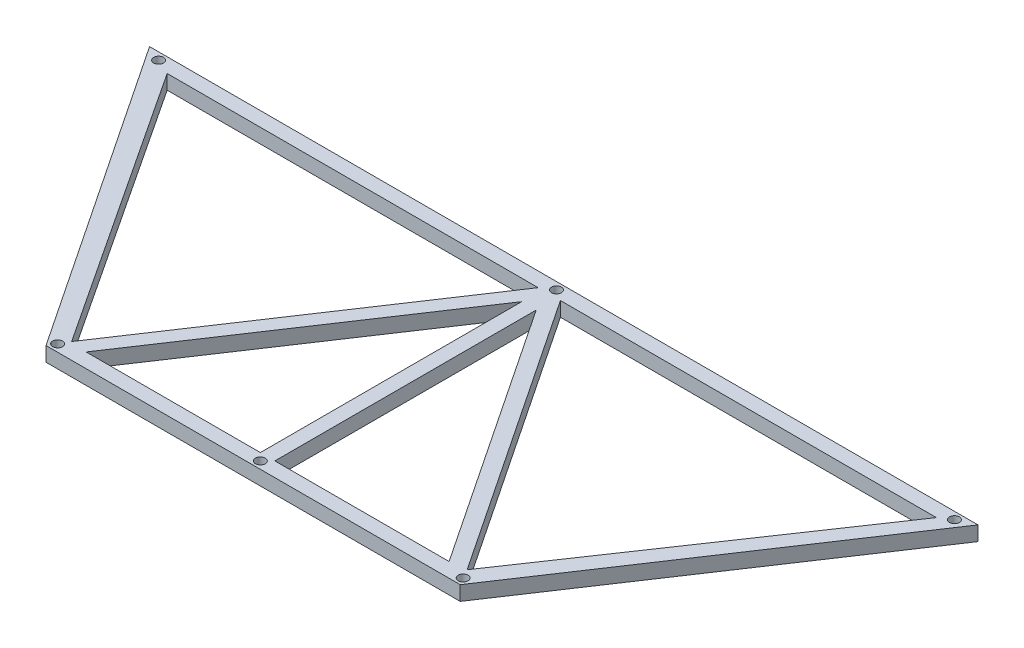
ISO-10303-21;
HEADER;
FILE_DESCRIPTION(('STEP AP214'),'2;1');
FILE_NAME('part.step','',(''),(''),'','','');
FILE_SCHEMA(('AUTOMOTIVE_DESIGN { 1 0 10303 214 1 1 1 1 }'));
ENDSEC;
DATA;
#1=APPLICATION_CONTEXT('core data for automotive mechanical design processes');
#2=APPLICATION_PROTOCOL_DEFINITION('international standard','automotive_design',2000,#1);
#3=PRODUCT_CONTEXT('',#1,'mechanical');
#4=PRODUCT('Part','Part','',(#3));
#5=PRODUCT_RELATED_PRODUCT_CATEGORY('part','',(#4));
#6=PRODUCT_DEFINITION_FORMATION('','',#4);
#7=PRODUCT_DEFINITION_CONTEXT('part definition',#1,'design');
#8=PRODUCT_DEFINITION('design','',#6,#7);
#9=PRODUCT_DEFINITION_SHAPE('','',#8);
#10=(LENGTH_UNIT() NAMED_UNIT(*) SI_UNIT(.MILLI.,.METRE.));
#11=(NAMED_UNIT(*) PLANE_ANGLE_UNIT() SI_UNIT($,.RADIAN.));
#12=(NAMED_UNIT(*) SI_UNIT($,.STERADIAN.) SOLID_ANGLE_UNIT());
#13=UNCERTAINTY_MEASURE_WITH_UNIT(LENGTH_MEASURE(1.E-05),#10,'distance_accuracy_value','');
#14=(GEOMETRIC_REPRESENTATION_CONTEXT(3) GLOBAL_UNCERTAINTY_ASSIGNED_CONTEXT((#13)) GLOBAL_UNIT_ASSIGNED_CONTEXT((#10,
#11,#12)) REPRESENTATION_CONTEXT('',''));
#15=CARTESIAN_POINT('',(0.,0.,0.));
#16=DIRECTION('',(0.,0.,1.));
#17=DIRECTION('',(1.,0.,0.));
#18=AXIS2_PLACEMENT_3D('',#15,#16,#17);
#19=CARTESIAN_POINT('',(0.,14.,0.));
#20=DIRECTION('',(0.,1.,0.));
#21=DIRECTION('',(0.,0.,1.));
#22=AXIS2_PLACEMENT_3D('',#19,#20,#21);
#23=PLANE('',#22);
#24=CARTESIAN_POINT('',(0.,14.,-7.));
#25=DIRECTION('',(0.,1.,0.));
#26=DIRECTION('',(0.,0.,1.));
#27=AXIS2_PLACEMENT_3D('',#24,#25,#26);
#28=CIRCLE('',#27,4.7625);
#29=CARTESIAN_POINT('',(0.,14.,-2.2375));
#30=VERTEX_POINT('',#29);
#31=EDGE_CURVE('E237',#30,#30,#28,.T.);
#32=ORIENTED_EDGE('',*,*,#31,.F.);
#33=EDGE_LOOP('',(#32));
#34=FACE_BOUND('',#33,.T.);
#35=CARTESIAN_POINT('',(384.258956968318,14.,-293.));
#36=DIRECTION('',(0.,1.,0.));
#37=DIRECTION('',(0.,0.,1.));
#38=AXIS2_PLACEMENT_3D('',#35,#36,#37);
#39=CIRCLE('',#38,4.76250000000001);
#40=CARTESIAN_POINT('',(384.258956968318,14.,-288.2375));
#41=VERTEX_POINT('',#40);
#42=EDGE_CURVE('E252',#41,#41,#39,.T.);
#43=ORIENTED_EDGE('',*,*,#42,.F.);
#44=EDGE_LOOP('',(#43));
#45=FACE_BOUND('',#44,.T.);
#46=DIRECTION('',(-1.,0.,0.));
#47=VECTOR('',#46,1.);
#48=CARTESIAN_POINT('',(10.7462863094159,14.,-286.));
#49=LINE('',#48,#47);
#50=CARTESIAN_POINT('',(373.840760714501,14.,-286.));
#51=VERTEX_POINT('',#50);
#52=CARTESIAN_POINT('',(10.7462863094159,14.,-286.));
#53=VERTEX_POINT('',#52);
#54=EDGE_CURVE('E271',#51,#53,#49,.T.);
#55=ORIENTED_EDGE('',*,*,#54,.F.);
#56=DIRECTION('',(0.560869786562697,0.,-0.827904029777072));
#57=VECTOR('',#56,1.);
#58=CARTESIAN_POINT('',(373.840760714501,14.,-286.));
#59=LINE('',#58,#57);
#60=CARTESIAN_POINT('',(190.836035911784,14.,-15.8653755964487));
#61=VERTEX_POINT('',#60);
#62=EDGE_CURVE('E268',#61,#51,#59,.T.);
#63=ORIENTED_EDGE('',*,*,#62,.F.);
#64=DIRECTION('',(0.55470019622523,0.,0.832050294337843));
#65=VECTOR('',#64,1.);
#66=CARTESIAN_POINT('',(190.836035911784,14.,-15.8653755964487));
#67=LINE('',#66,#65);
#68=EDGE_CURVE('E277',#53,#61,#67,.T.);
#69=ORIENTED_EDGE('',*,*,#68,.F.);
#70=EDGE_LOOP('',(#55,#63,#69));
#71=FACE_BOUND('',#70,.T.);
#72=DIRECTION('',(-0.55470019622523,0.,-0.832050294337843));
#73=VECTOR('',#72,1.);
#74=CARTESIAN_POINT('',(175.253713690584,14.,-14.0000000000001));
#75=LINE('',#74,#73);
#76=CARTESIAN_POINT('',(175.253713690584,14.,-14.0000000000001));
#77=VERTEX_POINT('',#76);
#78=CARTESIAN_POINT('',(6.99999999999995,14.,-266.380570535876));
#79=VERTEX_POINT('',#78);
#80=EDGE_CURVE('E301',#77,#79,#75,.T.);
#81=ORIENTED_EDGE('',*,*,#80,.F.);
#82=DIRECTION('',(1.,0.,0.));
#83=VECTOR('',#82,1.);
#84=CARTESIAN_POINT('',(175.253713690584,14.,-14.0000000000001));
#85=LINE('',#84,#83);
#86=CARTESIAN_POINT('',(7.00000000000001,14.,-14.));
#87=VERTEX_POINT('',#86);
#88=EDGE_CURVE('E302',#87,#77,#85,.T.);
#89=ORIENTED_EDGE('',*,*,#88,.F.);
#90=DIRECTION('',(0.,0.,1.));
#91=VECTOR('',#90,1.);
#92=CARTESIAN_POINT('',(7.00000000000001,14.,-14.));
#93=LINE('',#92,#91);
#94=EDGE_CURVE('E310',#79,#87,#93,.T.);
#95=ORIENTED_EDGE('',*,*,#94,.F.);
#96=EDGE_LOOP('',(#81,#89,#95));
#97=FACE_BOUND('',#96,.T.);
#98=CARTESIAN_POINT('',(-195.793523511959,14.,-7.));
#99=DIRECTION('',(0.,1.,0.));
#100=DIRECTION('',(0.,0.,1.));
#101=AXIS2_PLACEMENT_3D('',#98,#99,#100);
#102=CIRCLE('',#101,4.76250000000001);
#103=CARTESIAN_POINT('',(-195.793523511959,14.,-2.23749999999999));
#104=VERTEX_POINT('',#103);
#105=EDGE_CURVE('E331',#104,#104,#102,.T.);
#106=ORIENTED_EDGE('',*,*,#105,.F.);
#107=EDGE_LOOP('',(#106));
#108=FACE_BOUND('',#107,.T.);
#109=DIRECTION('',(0.554700196225229,0.,-0.832050294337844));
#110=VECTOR('',#109,1.);
#111=CARTESIAN_POINT('',(400.,14.,-300.));
#112=LINE('',#111,#110);
#113=CARTESIAN_POINT('',(200.,14.,0.));
#114=VERTEX_POINT('',#113);
#115=CARTESIAN_POINT('',(400.,14.,-300.));
#116=VERTEX_POINT('',#115);
#117=EDGE_CURVE('E345',#114,#116,#112,.T.);
#118=ORIENTED_EDGE('',*,*,#117,.T.);
#119=DIRECTION('',(-1.,0.,0.));
#120=VECTOR('',#119,1.);
#121=CARTESIAN_POINT('',(0.,14.,-300.));
#122=LINE('',#121,#120);
#123=CARTESIAN_POINT('',(-400.,14.,-300.));
#124=VERTEX_POINT('',#123);
#125=EDGE_CURVE('E347',#116,#124,#122,.T.);
#126=ORIENTED_EDGE('',*,*,#125,.T.);
#127=DIRECTION('',(0.554700196225229,0.,0.832050294337844));
#128=VECTOR('',#127,1.);
#129=CARTESIAN_POINT('',(-400.,14.,-300.));
#130=LINE('',#129,#128);
#131=CARTESIAN_POINT('',(-200.,14.,0.));
#132=VERTEX_POINT('',#131);
#133=EDGE_CURVE('E348',#124,#132,#130,.T.);
#134=ORIENTED_EDGE('',*,*,#133,.T.);
#135=DIRECTION('',(1.,0.,0.));
#136=VECTOR('',#135,1.);
#137=CARTESIAN_POINT('',(-200.,14.,0.));
#138=LINE('',#137,#136);
#139=EDGE_CURVE('E355',#132,#114,#138,.T.);
#140=ORIENTED_EDGE('',*,*,#139,.T.);
#141=EDGE_LOOP('',(#118,#126,#134,#140));
#142=FACE_BOUND('',#141,.T.);
#143=CARTESIAN_POINT('',(195.793523511959,14.,-7.));
#144=DIRECTION('',(0.,1.,0.));
#145=DIRECTION('',(0.,0.,-1.));
#146=AXIS2_PLACEMENT_3D('',#143,#144,#145);
#147=CIRCLE('',#146,4.76250000000001);
#148=CARTESIAN_POINT('',(195.793523511959,14.,-11.7625));
#149=VERTEX_POINT('',#148);
#150=EDGE_CURVE('E257',#149,#149,#147,.T.);
#151=ORIENTED_EDGE('',*,*,#150,.F.);
#152=EDGE_LOOP('',(#151));
#153=FACE_BOUND('',#152,.T.);
#154=CARTESIAN_POINT('',(-384.258956968318,14.,-293.));
#155=DIRECTION('',(0.,1.,0.));
#156=DIRECTION('',(0.,0.,-1.));
#157=AXIS2_PLACEMENT_3D('',#154,#155,#156);
#158=CIRCLE('',#157,4.76250000000001);
#159=CARTESIAN_POINT('',(-384.258956968318,14.,-297.7625));
#160=VERTEX_POINT('',#159);
#161=EDGE_CURVE('E243',#160,#160,#158,.T.);
#162=ORIENTED_EDGE('',*,*,#161,.F.);
#163=EDGE_LOOP('',(#162));
#164=FACE_BOUND('',#163,.T.);
#165=CARTESIAN_POINT('',(0.,14.,-293.));
#166=DIRECTION('',(0.,1.,0.));
#167=DIRECTION('',(0.,0.,1.));
#168=AXIS2_PLACEMENT_3D('',#165,#166,#167);
#169=CIRCLE('',#168,4.7625);
#170=CARTESIAN_POINT('',(0.,14.,-288.2375));
#171=VERTEX_POINT('',#170);
#172=EDGE_CURVE('E230',#171,#171,#169,.T.);
#173=ORIENTED_EDGE('',*,*,#172,.F.);
#174=EDGE_LOOP('',(#173));
#175=FACE_BOUND('',#174,.T.);
#176=DIRECTION('',(0.554700196225229,0.,-0.832050294337844));
#177=VECTOR('',#176,1.);
#178=CARTESIAN_POINT('',(-190.947369665805,14.,-15.6983749654168));
#179=LINE('',#178,#177);
#180=CARTESIAN_POINT('',(-190.947369665805,14.,-15.6983749654168));
#181=VERTEX_POINT('',#180);
#182=CARTESIAN_POINT('',(-10.7462863094161,14.,-286.));
#183=VERTEX_POINT('',#182);
#184=EDGE_CURVE('E196',#181,#183,#179,.T.);
#185=ORIENTED_EDGE('',*,*,#184,.F.);
#186=DIRECTION('',(0.550084799449605,0.,0.835108803339114));
#187=VECTOR('',#186,1.);
#188=CARTESIAN_POINT('',(-368.994606868348,14.,-286.));
#189=LINE('',#188,#187);
#190=CARTESIAN_POINT('',(-368.994606868348,14.,-286.));
#191=VERTEX_POINT('',#190);
#192=EDGE_CURVE('E193',#191,#181,#189,.T.);
#193=ORIENTED_EDGE('',*,*,#192,.F.);
#194=DIRECTION('',(-1.,0.,0.));
#195=VECTOR('',#194,1.);
#196=CARTESIAN_POINT('',(-10.7462863094161,14.,-286.));
#197=LINE('',#196,#195);
#198=EDGE_CURVE('E201',#183,#191,#197,.T.);
#199=ORIENTED_EDGE('',*,*,#198,.F.);
#200=EDGE_LOOP('',(#185,#193,#199));
#201=FACE_BOUND('',#200,.T.);
#202=DIRECTION('',(0.,0.,-1.));
#203=VECTOR('',#202,1.);
#204=CARTESIAN_POINT('',(-6.99999999999998,14.,-14.));
#205=LINE('',#204,#203);
#206=CARTESIAN_POINT('',(-6.99999999999998,14.,-14.));
#207=VERTEX_POINT('',#206);
#208=CARTESIAN_POINT('',(-7.0000000000001,14.,-266.380570535876));
#209=VERTEX_POINT('',#208);
#210=EDGE_CURVE('E169',#207,#209,#205,.T.);
#211=ORIENTED_EDGE('',*,*,#210,.F.);
#212=DIRECTION('',(1.,0.,0.));
#213=VECTOR('',#212,1.);
#214=CARTESIAN_POINT('',(-175.253713690584,14.,-14.));
#215=LINE('',#214,#213);
#216=CARTESIAN_POINT('',(-175.253713690584,14.,-14.));
#217=VERTEX_POINT('',#216);
#218=EDGE_CURVE('E157',#217,#207,#215,.T.);
#219=ORIENTED_EDGE('',*,*,#218,.F.);
#220=DIRECTION('',(-0.554700196225229,0.,0.832050294337844));
#221=VECTOR('',#220,1.);
#222=CARTESIAN_POINT('',(-175.253713690584,14.,-14.));
#223=LINE('',#222,#221);
#224=EDGE_CURVE('E179',#209,#217,#223,.T.);
#225=ORIENTED_EDGE('',*,*,#224,.F.);
#226=EDGE_LOOP('',(#211,#219,#225));
#227=FACE_BOUND('',#226,.T.);
#228=ADVANCED_FACE('F44',(#34,#45,#71,#97,#108,#142,#153,#164,#175,#201,#227),#23,.T.);
#229=CARTESIAN_POINT('',(0.,0.,0.));
#230=DIRECTION('',(0.,1.,0.));
#231=DIRECTION('',(0.,0.,1.));
#232=AXIS2_PLACEMENT_3D('',#229,#230,#231);
#233=PLANE('',#232);
#234=DIRECTION('',(0.550084799449605,0.,0.835108803339114));
#235=VECTOR('',#234,1.);
#236=CARTESIAN_POINT('',(-368.994606868348,0.,-286.));
#237=LINE('',#236,#235);
#238=CARTESIAN_POINT('',(-368.994606868348,0.,-286.));
#239=VERTEX_POINT('',#238);
#240=CARTESIAN_POINT('',(-190.947369665805,0.,-15.6983749654168));
#241=VERTEX_POINT('',#240);
#242=EDGE_CURVE('E177',#239,#241,#237,.T.);
#243=ORIENTED_EDGE('',*,*,#242,.T.);
#244=DIRECTION('',(0.554700196225229,0.,-0.832050294337844));
#245=VECTOR('',#244,1.);
#246=CARTESIAN_POINT('',(-190.947369665805,0.,-15.6983749654168));
#247=LINE('',#246,#245);
#248=CARTESIAN_POINT('',(-10.7462863094161,0.,-286.));
#249=VERTEX_POINT('',#248);
#250=EDGE_CURVE('E209',#241,#249,#247,.T.);
#251=ORIENTED_EDGE('',*,*,#250,.T.);
#252=DIRECTION('',(-1.,0.,0.));
#253=VECTOR('',#252,1.);
#254=CARTESIAN_POINT('',(-10.7462863094161,0.,-286.));
#255=LINE('',#254,#253);
#256=EDGE_CURVE('E200',#249,#239,#255,.T.);
#257=ORIENTED_EDGE('',*,*,#256,.T.);
#258=EDGE_LOOP('',(#243,#251,#257));
#259=FACE_BOUND('',#258,.T.);
#260=DIRECTION('',(1.,0.,0.));
#261=VECTOR('',#260,1.);
#262=CARTESIAN_POINT('',(175.253713690584,0.,-14.0000000000001));
#263=LINE('',#262,#261);
#264=CARTESIAN_POINT('',(7.00000000000001,0.,-14.));
#265=VERTEX_POINT('',#264);
#266=CARTESIAN_POINT('',(175.253713690584,0.,-14.0000000000001));
#267=VERTEX_POINT('',#266);
#268=EDGE_CURVE('E297',#265,#267,#263,.T.);
#269=ORIENTED_EDGE('',*,*,#268,.T.);
#270=DIRECTION('',(-0.55470019622523,0.,-0.832050294337843));
#271=VECTOR('',#270,1.);
#272=CARTESIAN_POINT('',(175.253713690584,0.,-14.0000000000001));
#273=LINE('',#272,#271);
#274=CARTESIAN_POINT('',(6.99999999999995,0.,-266.380570535876));
#275=VERTEX_POINT('',#274);
#276=EDGE_CURVE('E316',#267,#275,#273,.T.);
#277=ORIENTED_EDGE('',*,*,#276,.T.);
#278=DIRECTION('',(0.,0.,1.));
#279=VECTOR('',#278,1.);
#280=CARTESIAN_POINT('',(7.00000000000001,0.,-14.));
#281=LINE('',#280,#279);
#282=EDGE_CURVE('E303',#275,#265,#281,.T.);
#283=ORIENTED_EDGE('',*,*,#282,.T.);
#284=EDGE_LOOP('',(#269,#277,#283));
#285=FACE_BOUND('',#284,.T.);
#286=DIRECTION('',(0.554700196225229,0.,-0.832050294337844));
#287=VECTOR('',#286,1.);
#288=CARTESIAN_POINT('',(400.,0.,-300.));
#289=LINE('',#288,#287);
#290=CARTESIAN_POINT('',(200.,0.,0.));
#291=VERTEX_POINT('',#290);
#292=CARTESIAN_POINT('',(400.,0.,-300.));
#293=VERTEX_POINT('',#292);
#294=EDGE_CURVE('E340',#291,#293,#289,.T.);
#295=ORIENTED_EDGE('',*,*,#294,.F.);
#296=DIRECTION('',(1.,0.,0.));
#297=VECTOR('',#296,1.);
#298=CARTESIAN_POINT('',(200.,0.,0.));
#299=LINE('',#298,#297);
#300=CARTESIAN_POINT('',(-200.,0.,0.));
#301=VERTEX_POINT('',#300);
#302=EDGE_CURVE('E350',#301,#291,#299,.T.);
#303=ORIENTED_EDGE('',*,*,#302,.F.);
#304=DIRECTION('',(0.554700196225229,0.,0.832050294337844));
#305=VECTOR('',#304,1.);
#306=CARTESIAN_POINT('',(-400.,0.,-300.));
#307=LINE('',#306,#305);
#308=CARTESIAN_POINT('',(-400.,0.,-300.));
#309=VERTEX_POINT('',#308);
#310=EDGE_CURVE('E361',#309,#301,#307,.T.);
#311=ORIENTED_EDGE('',*,*,#310,.F.);
#312=DIRECTION('',(-1.,0.,0.));
#313=VECTOR('',#312,1.);
#314=CARTESIAN_POINT('',(0.,0.,-300.));
#315=LINE('',#314,#313);
#316=EDGE_CURVE('E358',#293,#309,#315,.T.);
#317=ORIENTED_EDGE('',*,*,#316,.F.);
#318=EDGE_LOOP('',(#295,#303,#311,#317));
#319=FACE_BOUND('',#318,.T.);
#320=CARTESIAN_POINT('',(-195.793523511959,0.,-7.));
#321=DIRECTION('',(0.,1.,0.));
#322=DIRECTION('',(0.,0.,1.));
#323=AXIS2_PLACEMENT_3D('',#320,#321,#322);
#324=CIRCLE('',#323,4.76250000000001);
#325=CARTESIAN_POINT('',(-195.793523511959,0.,-2.23749999999999));
#326=VERTEX_POINT('',#325);
#327=EDGE_CURVE('E334',#326,#326,#324,.T.);
#328=ORIENTED_EDGE('',*,*,#327,.T.);
#329=EDGE_LOOP('',(#328));
#330=FACE_BOUND('',#329,.T.);
#331=DIRECTION('',(0.560869786562697,0.,-0.827904029777072));
#332=VECTOR('',#331,1.);
#333=CARTESIAN_POINT('',(373.840760714501,0.,-286.));
#334=LINE('',#333,#332);
#335=CARTESIAN_POINT('',(190.836035911784,0.,-15.8653755964487));
#336=VERTEX_POINT('',#335);
#337=CARTESIAN_POINT('',(373.840760714501,0.,-286.));
#338=VERTEX_POINT('',#337);
#339=EDGE_CURVE('E262',#336,#338,#334,.T.);
#340=ORIENTED_EDGE('',*,*,#339,.T.);
#341=DIRECTION('',(-1.,0.,0.));
#342=VECTOR('',#341,1.);
#343=CARTESIAN_POINT('',(10.7462863094159,0.,-286.));
#344=LINE('',#343,#342);
#345=CARTESIAN_POINT('',(10.7462863094159,0.,-286.));
#346=VERTEX_POINT('',#345);
#347=EDGE_CURVE('E285',#338,#346,#344,.T.);
#348=ORIENTED_EDGE('',*,*,#347,.T.);
#349=DIRECTION('',(0.55470019622523,0.,0.832050294337843));
#350=VECTOR('',#349,1.);
#351=CARTESIAN_POINT('',(190.836035911784,0.,-15.8653755964487));
#352=LINE('',#351,#350);
#353=EDGE_CURVE('E275',#346,#336,#352,.T.);
#354=ORIENTED_EDGE('',*,*,#353,.T.);
#355=EDGE_LOOP('',(#340,#348,#354));
#356=FACE_BOUND('',#355,.T.);
#357=CARTESIAN_POINT('',(195.793523511959,0.,-7.));
#358=DIRECTION('',(0.,1.,0.));
#359=DIRECTION('',(0.,0.,-1.));
#360=AXIS2_PLACEMENT_3D('',#357,#358,#359);
#361=CIRCLE('',#360,4.76250000000001);
#362=CARTESIAN_POINT('',(195.793523511959,0.,-11.7625));
#363=VERTEX_POINT('',#362);
#364=EDGE_CURVE('E258',#363,#363,#361,.T.);
#365=ORIENTED_EDGE('',*,*,#364,.T.);
#366=EDGE_LOOP('',(#365));
#367=FACE_BOUND('',#366,.T.);
#368=CARTESIAN_POINT('',(384.258956968318,0.,-293.));
#369=DIRECTION('',(0.,1.,0.));
#370=DIRECTION('',(0.,0.,1.));
#371=AXIS2_PLACEMENT_3D('',#368,#369,#370);
#372=CIRCLE('',#371,4.76250000000001);
#373=CARTESIAN_POINT('',(384.258956968318,0.,-288.2375));
#374=VERTEX_POINT('',#373);
#375=EDGE_CURVE('E249',#374,#374,#372,.T.);
#376=ORIENTED_EDGE('',*,*,#375,.T.);
#377=EDGE_LOOP('',(#376));
#378=FACE_BOUND('',#377,.T.);
#379=CARTESIAN_POINT('',(-384.258956968318,0.,-293.));
#380=DIRECTION('',(0.,1.,0.));
#381=DIRECTION('',(0.,0.,-1.));
#382=AXIS2_PLACEMENT_3D('',#379,#380,#381);
#383=CIRCLE('',#382,4.76250000000001);
#384=CARTESIAN_POINT('',(-384.258956968318,0.,-297.7625));
#385=VERTEX_POINT('',#384);
#386=EDGE_CURVE('E238',#385,#385,#383,.T.);
#387=ORIENTED_EDGE('',*,*,#386,.T.);
#388=EDGE_LOOP('',(#387));
#389=FACE_BOUND('',#388,.T.);
#390=CARTESIAN_POINT('',(0.,0.,-7.));
#391=DIRECTION('',(0.,1.,0.));
#392=DIRECTION('',(0.,0.,1.));
#393=AXIS2_PLACEMENT_3D('',#390,#391,#392);
#394=CIRCLE('',#393,4.7625);
#395=CARTESIAN_POINT('',(0.,0.,-2.2375));
#396=VERTEX_POINT('',#395);
#397=EDGE_CURVE('E235',#396,#396,#394,.T.);
#398=ORIENTED_EDGE('',*,*,#397,.T.);
#399=EDGE_LOOP('',(#398));
#400=FACE_BOUND('',#399,.T.);
#401=CARTESIAN_POINT('',(0.,0.,-293.));
#402=DIRECTION('',(0.,1.,0.));
#403=DIRECTION('',(0.,0.,1.));
#404=AXIS2_PLACEMENT_3D('',#401,#402,#403);
#405=CIRCLE('',#404,4.7625);
#406=CARTESIAN_POINT('',(0.,0.,-288.2375));
#407=VERTEX_POINT('',#406);
#408=EDGE_CURVE('E226',#407,#407,#405,.T.);
#409=ORIENTED_EDGE('',*,*,#408,.T.);
#410=EDGE_LOOP('',(#409));
#411=FACE_BOUND('',#410,.T.);
#412=DIRECTION('',(1.,0.,0.));
#413=VECTOR('',#412,1.);
#414=CARTESIAN_POINT('',(-175.253713690584,0.,-14.));
#415=LINE('',#414,#413);
#416=CARTESIAN_POINT('',(-175.253713690584,0.,-14.));
#417=VERTEX_POINT('',#416);
#418=CARTESIAN_POINT('',(-6.99999999999998,0.,-14.));
#419=VERTEX_POINT('',#418);
#420=EDGE_CURVE('E66',#417,#419,#415,.T.);
#421=ORIENTED_EDGE('',*,*,#420,.T.);
#422=DIRECTION('',(0.,0.,-1.));
#423=VECTOR('',#422,1.);
#424=CARTESIAN_POINT('',(-6.99999999999998,0.,-14.));
#425=LINE('',#424,#423);
#426=CARTESIAN_POINT('',(-7.00000000000005,0.,-266.380570535876));
#427=VERTEX_POINT('',#426);
#428=EDGE_CURVE('E173',#419,#427,#425,.T.);
#429=ORIENTED_EDGE('',*,*,#428,.T.);
#430=DIRECTION('',(-0.554700196225229,0.,0.832050294337844));
#431=VECTOR('',#430,1.);
#432=CARTESIAN_POINT('',(-175.253713690584,0.,-14.));
#433=LINE('',#432,#431);
#434=EDGE_CURVE('E166',#427,#417,#433,.T.);
#435=ORIENTED_EDGE('',*,*,#434,.T.);
#436=EDGE_LOOP('',(#421,#429,#435));
#437=FACE_BOUND('',#436,.T.);
#438=ADVANCED_FACE('F387',(#259,#285,#319,#330,#356,#367,#378,#389,#400,#411,#437),#233,.F.);
#439=CARTESIAN_POINT('',(400.,14.,-300.));
#440=DIRECTION('',(-0.832050294337844,0.,-0.554700196225229));
#441=DIRECTION('',(-0.554700196225229,0.,0.832050294337844));
#442=AXIS2_PLACEMENT_3D('',#439,#440,#441);
#443=PLANE('',#442);
#444=ORIENTED_EDGE('',*,*,#294,.T.);
#445=DIRECTION('',(0.,-1.,0.));
#446=VECTOR('',#445,1.);
#447=CARTESIAN_POINT('',(400.,14.,-300.));
#448=LINE('',#447,#446);
#449=EDGE_CURVE('E11',#116,#293,#448,.T.);
#450=ORIENTED_EDGE('',*,*,#449,.F.);
#451=ORIENTED_EDGE('',*,*,#117,.F.);
#452=DIRECTION('',(0.,-1.,0.));
#453=VECTOR('',#452,1.);
#454=CARTESIAN_POINT('',(200.,14.,0.));
#455=LINE('',#454,#453);
#456=EDGE_CURVE('E357',#114,#291,#455,.T.);
#457=ORIENTED_EDGE('',*,*,#456,.T.);
#458=EDGE_LOOP('',(#444,#450,#451,#457));
#459=FACE_BOUND('',#458,.T.);
#460=ADVANCED_FACE('F50',(#459),#443,.F.);
#461=CARTESIAN_POINT('',(0.,14.,-300.));
#462=DIRECTION('',(0.,0.,1.));
#463=DIRECTION('',(1.,0.,0.));
#464=AXIS2_PLACEMENT_3D('',#461,#462,#463);
#465=PLANE('',#464);
#466=ORIENTED_EDGE('',*,*,#316,.T.);
#467=DIRECTION('',(0.,-1.,0.));
#468=VECTOR('',#467,1.);
#469=CARTESIAN_POINT('',(-400.,14.,-300.));
#470=LINE('',#469,#468);
#471=EDGE_CURVE('E53',#124,#309,#470,.T.);
#472=ORIENTED_EDGE('',*,*,#471,.F.);
#473=ORIENTED_EDGE('',*,*,#125,.F.);
#474=ORIENTED_EDGE('',*,*,#449,.T.);
#475=EDGE_LOOP('',(#466,#472,#473,#474));
#476=FACE_BOUND('',#475,.T.);
#477=ADVANCED_FACE('F400',(#476),#465,.F.);
#478=CARTESIAN_POINT('',(-400.,14.,-300.));
#479=DIRECTION('',(0.832050294337844,0.,-0.554700196225229));
#480=DIRECTION('',(-0.554700196225229,0.,-0.832050294337844));
#481=AXIS2_PLACEMENT_3D('',#478,#479,#480);
#482=PLANE('',#481);
#483=ORIENTED_EDGE('',*,*,#310,.T.);
#484=DIRECTION('',(0.,-1.,0.));
#485=VECTOR('',#484,1.);
#486=CARTESIAN_POINT('',(-200.,14.,0.));
#487=LINE('',#486,#485);
#488=EDGE_CURVE('E375',#132,#301,#487,.T.);
#489=ORIENTED_EDGE('',*,*,#488,.F.);
#490=ORIENTED_EDGE('',*,*,#133,.F.);
#491=ORIENTED_EDGE('',*,*,#471,.T.);
#492=EDGE_LOOP('',(#483,#489,#490,#491));
#493=FACE_BOUND('',#492,.T.);
#494=ADVANCED_FACE('F381',(#493),#482,.F.);
#495=CARTESIAN_POINT('',(200.,14.,0.));
#496=DIRECTION('',(0.,0.,-1.));
#497=DIRECTION('',(-1.,0.,0.));
#498=AXIS2_PLACEMENT_3D('',#495,#496,#497);
#499=PLANE('',#498);
#500=ORIENTED_EDGE('',*,*,#302,.T.);
#501=ORIENTED_EDGE('',*,*,#456,.F.);
#502=ORIENTED_EDGE('',*,*,#139,.F.);
#503=ORIENTED_EDGE('',*,*,#488,.T.);
#504=EDGE_LOOP('',(#500,#501,#502,#503));
#505=FACE_BOUND('',#504,.T.);
#506=ADVANCED_FACE('F388',(#505),#499,.F.);
#507=CARTESIAN_POINT('',(-195.793523511959,14.,-7.));
#508=DIRECTION('',(0.,-1.,0.));
#509=DIRECTION('',(0.,0.,-1.));
#510=AXIS2_PLACEMENT_3D('',#507,#508,#509);
#511=CYLINDRICAL_SURFACE('',#510,4.76250000000001);
#512=ORIENTED_EDGE('',*,*,#105,.T.);
#513=EDGE_LOOP('',(#512));
#514=FACE_BOUND('',#513,.T.);
#515=ORIENTED_EDGE('',*,*,#327,.F.);
#516=EDGE_LOOP('',(#515));
#517=FACE_BOUND('',#516,.T.);
#518=ADVANCED_FACE('F413',(#514,#517),#511,.F.);
#519=CARTESIAN_POINT('',(175.253713690584,14.,-14.0000000000001));
#520=DIRECTION('',(0.,0.,-1.));
#521=DIRECTION('',(-1.,0.,0.));
#522=AXIS2_PLACEMENT_3D('',#519,#520,#521);
#523=PLANE('',#522);
#524=ORIENTED_EDGE('',*,*,#268,.F.);
#525=DIRECTION('',(0.,-1.,0.));
#526=VECTOR('',#525,1.);
#527=CARTESIAN_POINT('',(7.00000000000001,14.,-14.));
#528=LINE('',#527,#526);
#529=EDGE_CURVE('E315',#87,#265,#528,.T.);
#530=ORIENTED_EDGE('',*,*,#529,.F.);
#531=ORIENTED_EDGE('',*,*,#88,.T.);
#532=DIRECTION('',(0.,-1.,0.));
#533=VECTOR('',#532,1.);
#534=CARTESIAN_POINT('',(175.253713690584,14.,-14.0000000000001));
#535=LINE('',#534,#533);
#536=EDGE_CURVE('E328',#77,#267,#535,.T.);
#537=ORIENTED_EDGE('',*,*,#536,.T.);
#538=EDGE_LOOP('',(#524,#530,#531,#537));
#539=FACE_BOUND('',#538,.T.);
#540=ADVANCED_FACE('F425',(#539),#523,.T.);
#541=CARTESIAN_POINT('',(175.253713690584,14.,-14.0000000000001));
#542=DIRECTION('',(-0.832050294337843,0.,0.55470019622523));
#543=DIRECTION('',(0.55470019622523,0.,0.832050294337843));
#544=AXIS2_PLACEMENT_3D('',#541,#542,#543);
#545=PLANE('',#544);
#546=ORIENTED_EDGE('',*,*,#276,.F.);
#547=ORIENTED_EDGE('',*,*,#536,.F.);
#548=ORIENTED_EDGE('',*,*,#80,.T.);
#549=DIRECTION('',(0.,-1.,0.));
#550=VECTOR('',#549,1.);
#551=CARTESIAN_POINT('',(6.99999999999995,14.,-266.380570535876));
#552=LINE('',#551,#550);
#553=EDGE_CURVE('E326',#79,#275,#552,.T.);
#554=ORIENTED_EDGE('',*,*,#553,.T.);
#555=EDGE_LOOP('',(#546,#547,#548,#554));
#556=FACE_BOUND('',#555,.T.);
#557=ADVANCED_FACE('F430',(#556),#545,.T.);
#558=CARTESIAN_POINT('',(7.00000000000001,14.,-14.));
#559=DIRECTION('',(1.,0.,0.));
#560=DIRECTION('',(0.,0.,-1.));
#561=AXIS2_PLACEMENT_3D('',#558,#559,#560);
#562=PLANE('',#561);
#563=ORIENTED_EDGE('',*,*,#282,.F.);
#564=ORIENTED_EDGE('',*,*,#553,.F.);
#565=ORIENTED_EDGE('',*,*,#94,.T.);
#566=ORIENTED_EDGE('',*,*,#529,.T.);
#567=EDGE_LOOP('',(#563,#564,#565,#566));
#568=FACE_BOUND('',#567,.T.);
#569=ADVANCED_FACE('F500',(#568),#562,.T.);
#570=CARTESIAN_POINT('',(373.840760714501,14.,-286.));
#571=DIRECTION('',(-0.827904029777072,0.,-0.560869786562697));
#572=DIRECTION('',(-0.560869786562697,0.,0.827904029777072));
#573=AXIS2_PLACEMENT_3D('',#570,#571,#572);
#574=PLANE('',#573);
#575=ORIENTED_EDGE('',*,*,#339,.F.);
#576=DIRECTION('',(0.,-1.,0.));
#577=VECTOR('',#576,1.);
#578=CARTESIAN_POINT('',(190.836035911784,14.,-15.8653755964487));
#579=LINE('',#578,#577);
#580=EDGE_CURVE('E276',#61,#336,#579,.T.);
#581=ORIENTED_EDGE('',*,*,#580,.F.);
#582=ORIENTED_EDGE('',*,*,#62,.T.);
#583=DIRECTION('',(0.,-1.,0.));
#584=VECTOR('',#583,1.);
#585=CARTESIAN_POINT('',(373.840760714501,14.,-286.));
#586=LINE('',#585,#584);
#587=EDGE_CURVE('E299',#51,#338,#586,.T.);
#588=ORIENTED_EDGE('',*,*,#587,.T.);
#589=EDGE_LOOP('',(#575,#581,#582,#588));
#590=FACE_BOUND('',#589,.T.);
#591=ADVANCED_FACE('F492',(#590),#574,.T.);
#592=CARTESIAN_POINT('',(10.7462863094159,14.,-286.));
#593=DIRECTION('',(0.,0.,1.));
#594=DIRECTION('',(1.,0.,0.));
#595=AXIS2_PLACEMENT_3D('',#592,#593,#594);
#596=PLANE('',#595);
#597=ORIENTED_EDGE('',*,*,#347,.F.);
#598=ORIENTED_EDGE('',*,*,#587,.F.);
#599=ORIENTED_EDGE('',*,*,#54,.T.);
#600=DIRECTION('',(0.,-1.,0.));
#601=VECTOR('',#600,1.);
#602=CARTESIAN_POINT('',(10.7462863094159,14.,-286.));
#603=LINE('',#602,#601);
#604=EDGE_CURVE('E291',#53,#346,#603,.T.);
#605=ORIENTED_EDGE('',*,*,#604,.T.);
#606=EDGE_LOOP('',(#597,#598,#599,#605));
#607=FACE_BOUND('',#606,.T.);
#608=ADVANCED_FACE('F487',(#607),#596,.T.);
#609=CARTESIAN_POINT('',(190.836035911784,14.,-15.8653755964487));
#610=DIRECTION('',(0.832050294337843,0.,-0.55470019622523));
#611=DIRECTION('',(-0.55470019622523,0.,-0.832050294337843));
#612=AXIS2_PLACEMENT_3D('',#609,#610,#611);
#613=PLANE('',#612);
#614=ORIENTED_EDGE('',*,*,#353,.F.);
#615=ORIENTED_EDGE('',*,*,#604,.F.);
#616=ORIENTED_EDGE('',*,*,#68,.T.);
#617=ORIENTED_EDGE('',*,*,#580,.T.);
#618=EDGE_LOOP('',(#614,#615,#616,#617));
#619=FACE_BOUND('',#618,.T.);
#620=ADVANCED_FACE('F484',(#619),#613,.T.);
#621=CARTESIAN_POINT('',(195.793523511959,14.,-7.));
#622=DIRECTION('',(0.,-1.,0.));
#623=DIRECTION('',(0.,0.,-1.));
#624=AXIS2_PLACEMENT_3D('',#621,#622,#623);
#625=CYLINDRICAL_SURFACE('',#624,4.76250000000001);
#626=ORIENTED_EDGE('',*,*,#150,.T.);
#627=EDGE_LOOP('',(#626));
#628=FACE_BOUND('',#627,.T.);
#629=ORIENTED_EDGE('',*,*,#364,.F.);
#630=EDGE_LOOP('',(#629));
#631=FACE_BOUND('',#630,.T.);
#632=ADVANCED_FACE('F481',(#628,#631),#625,.F.);
#633=CARTESIAN_POINT('',(384.258956968318,14.,-293.));
#634=DIRECTION('',(0.,-1.,0.));
#635=DIRECTION('',(0.,0.,-1.));
#636=AXIS2_PLACEMENT_3D('',#633,#634,#635);
#637=CYLINDRICAL_SURFACE('',#636,4.76250000000001);
#638=ORIENTED_EDGE('',*,*,#42,.T.);
#639=EDGE_LOOP('',(#638));
#640=FACE_BOUND('',#639,.T.);
#641=ORIENTED_EDGE('',*,*,#375,.F.);
#642=EDGE_LOOP('',(#641));
#643=FACE_BOUND('',#642,.T.);
#644=ADVANCED_FACE('F480',(#640,#643),#637,.F.);
#645=CARTESIAN_POINT('',(-384.258956968318,14.,-293.));
#646=DIRECTION('',(0.,-1.,0.));
#647=DIRECTION('',(0.,0.,-1.));
#648=AXIS2_PLACEMENT_3D('',#645,#646,#647);
#649=CYLINDRICAL_SURFACE('',#648,4.76250000000001);
#650=ORIENTED_EDGE('',*,*,#161,.T.);
#651=EDGE_LOOP('',(#650));
#652=FACE_BOUND('',#651,.T.);
#653=ORIENTED_EDGE('',*,*,#386,.F.);
#654=EDGE_LOOP('',(#653));
#655=FACE_BOUND('',#654,.T.);
#656=ADVANCED_FACE('F471',(#652,#655),#649,.F.);
#657=CARTESIAN_POINT('',(0.,14.,-7.));
#658=DIRECTION('',(0.,-1.,0.));
#659=DIRECTION('',(0.,0.,-1.));
#660=AXIS2_PLACEMENT_3D('',#657,#658,#659);
#661=CYLINDRICAL_SURFACE('',#660,4.7625);
#662=ORIENTED_EDGE('',*,*,#31,.T.);
#663=EDGE_LOOP('',(#662));
#664=FACE_BOUND('',#663,.T.);
#665=ORIENTED_EDGE('',*,*,#397,.F.);
#666=EDGE_LOOP('',(#665));
#667=FACE_BOUND('',#666,.T.);
#668=ADVANCED_FACE('F466',(#664,#667),#661,.F.);
#669=CARTESIAN_POINT('',(0.,14.,-293.));
#670=DIRECTION('',(0.,-1.,0.));
#671=DIRECTION('',(0.,0.,-1.));
#672=AXIS2_PLACEMENT_3D('',#669,#670,#671);
#673=CYLINDRICAL_SURFACE('',#672,4.7625);
#674=ORIENTED_EDGE('',*,*,#172,.T.);
#675=EDGE_LOOP('',(#674));
#676=FACE_BOUND('',#675,.T.);
#677=ORIENTED_EDGE('',*,*,#408,.F.);
#678=EDGE_LOOP('',(#677));
#679=FACE_BOUND('',#678,.T.);
#680=ADVANCED_FACE('F462',(#676,#679),#673,.F.);
#681=CARTESIAN_POINT('',(-368.994606868348,14.,-286.));
#682=DIRECTION('',(0.835108803339114,0.,-0.550084799449605));
#683=DIRECTION('',(-0.550084799449605,0.,-0.835108803339115));
#684=AXIS2_PLACEMENT_3D('',#681,#682,#683);
#685=PLANE('',#684);
#686=ORIENTED_EDGE('',*,*,#242,.F.);
#687=DIRECTION('',(0.,-1.,0.));
#688=VECTOR('',#687,1.);
#689=CARTESIAN_POINT('',(-368.994606868348,14.,-286.));
#690=LINE('',#689,#688);
#691=EDGE_CURVE('E206',#191,#239,#690,.T.);
#692=ORIENTED_EDGE('',*,*,#691,.F.);
#693=ORIENTED_EDGE('',*,*,#192,.T.);
#694=DIRECTION('',(0.,-1.,0.));
#695=VECTOR('',#694,1.);
#696=CARTESIAN_POINT('',(-190.947369665805,14.,-15.6983749654168));
#697=LINE('',#696,#695);
#698=EDGE_CURVE('E224',#181,#241,#697,.T.);
#699=ORIENTED_EDGE('',*,*,#698,.T.);
#700=EDGE_LOOP('',(#686,#692,#693,#699));
#701=FACE_BOUND('',#700,.T.);
#702=ADVANCED_FACE('F464',(#701),#685,.T.);
#703=CARTESIAN_POINT('',(-190.947369665805,14.,-15.6983749654168));
#704=DIRECTION('',(-0.832050294337844,0.,-0.554700196225229));
#705=DIRECTION('',(-0.554700196225229,0.,0.832050294337844));
#706=AXIS2_PLACEMENT_3D('',#703,#704,#705);
#707=PLANE('',#706);
#708=ORIENTED_EDGE('',*,*,#250,.F.);
#709=ORIENTED_EDGE('',*,*,#698,.F.);
#710=ORIENTED_EDGE('',*,*,#184,.T.);
#711=DIRECTION('',(0.,-1.,0.));
#712=VECTOR('',#711,1.);
#713=CARTESIAN_POINT('',(-10.7462863094161,14.,-286.));
#714=LINE('',#713,#712);
#715=EDGE_CURVE('E219',#183,#249,#714,.T.);
#716=ORIENTED_EDGE('',*,*,#715,.T.);
#717=EDGE_LOOP('',(#708,#709,#710,#716));
#718=FACE_BOUND('',#717,.T.);
#719=ADVANCED_FACE('F460',(#718),#707,.T.);
#720=CARTESIAN_POINT('',(-10.7462863094161,14.,-286.));
#721=DIRECTION('',(0.,0.,1.));
#722=DIRECTION('',(1.,0.,0.));
#723=AXIS2_PLACEMENT_3D('',#720,#721,#722);
#724=PLANE('',#723);
#725=ORIENTED_EDGE('',*,*,#256,.F.);
#726=ORIENTED_EDGE('',*,*,#715,.F.);
#727=ORIENTED_EDGE('',*,*,#198,.T.);
#728=ORIENTED_EDGE('',*,*,#691,.T.);
#729=EDGE_LOOP('',(#725,#726,#727,#728));
#730=FACE_BOUND('',#729,.T.);
#731=ADVANCED_FACE('F451',(#730),#724,.T.);
#732=CARTESIAN_POINT('',(-175.253713690584,14.,-14.));
#733=DIRECTION('',(0.,0.,-1.));
#734=DIRECTION('',(-1.,0.,0.));
#735=AXIS2_PLACEMENT_3D('',#732,#733,#734);
#736=PLANE('',#735);
#737=ORIENTED_EDGE('',*,*,#420,.F.);
#738=DIRECTION('',(0.,-1.,0.));
#739=VECTOR('',#738,1.);
#740=CARTESIAN_POINT('',(-175.253713690584,14.,-14.));
#741=LINE('',#740,#739);
#742=EDGE_CURVE('E162',#217,#417,#741,.T.);
#743=ORIENTED_EDGE('',*,*,#742,.F.);
#744=ORIENTED_EDGE('',*,*,#218,.T.);
#745=DIRECTION('',(0.,-1.,0.));
#746=VECTOR('',#745,1.);
#747=CARTESIAN_POINT('',(-6.99999999999998,14.,-14.));
#748=LINE('',#747,#746);
#749=EDGE_CURVE('E165',#207,#419,#748,.T.);
#750=ORIENTED_EDGE('',*,*,#749,.T.);
#751=EDGE_LOOP('',(#737,#743,#744,#750));
#752=FACE_BOUND('',#751,.T.);
#753=ADVANCED_FACE('F161',(#752),#736,.T.);
#754=CARTESIAN_POINT('',(-6.99999999999998,14.,-14.));
#755=DIRECTION('',(-1.,0.,0.));
#756=DIRECTION('',(0.,0.,1.));
#757=AXIS2_PLACEMENT_3D('',#754,#755,#756);
#758=PLANE('',#757);
#759=ORIENTED_EDGE('',*,*,#428,.F.);
#760=ORIENTED_EDGE('',*,*,#749,.F.);
#761=ORIENTED_EDGE('',*,*,#210,.T.);
#762=DIRECTION('',(0.,-1.,0.));
#763=VECTOR('',#762,1.);
#764=CARTESIAN_POINT('',(-7.00000000000005,14.,-266.380570535876));
#765=LINE('',#764,#763);
#766=EDGE_CURVE('E64',#209,#427,#765,.T.);
#767=ORIENTED_EDGE('',*,*,#766,.T.);
#768=EDGE_LOOP('',(#759,#760,#761,#767));
#769=FACE_BOUND('',#768,.T.);
#770=ADVANCED_FACE('F171',(#769),#758,.T.);
#771=CARTESIAN_POINT('',(-175.253713690584,14.,-14.));
#772=DIRECTION('',(0.832050294337844,0.,0.554700196225229));
#773=DIRECTION('',(0.554700196225229,0.,-0.832050294337844));
#774=AXIS2_PLACEMENT_3D('',#771,#772,#773);
#775=PLANE('',#774);
#776=ORIENTED_EDGE('',*,*,#434,.F.);
#777=ORIENTED_EDGE('',*,*,#766,.F.);
#778=ORIENTED_EDGE('',*,*,#224,.T.);
#779=ORIENTED_EDGE('',*,*,#742,.T.);
#780=EDGE_LOOP('',(#776,#777,#778,#779));
#781=FACE_BOUND('',#780,.T.);
#782=ADVANCED_FACE('F441',(#781),#775,.T.);
#783=CLOSED_SHELL('',(#228,#438,#460,#477,#494,#506,#518,#540,#557,#569,#591,#608,#620,#632,
#644,#656,#668,#680,#702,#719,#731,#753,#770,#782));
#784=MANIFOLD_SOLID_BREP('B2',#783);
#785=ADVANCED_BREP_SHAPE_REPRESENTATION('',(#18,#784),#14);
#786=SHAPE_DEFINITION_REPRESENTATION(#9,#785);
ENDSEC;
END-ISO-10303-21;
